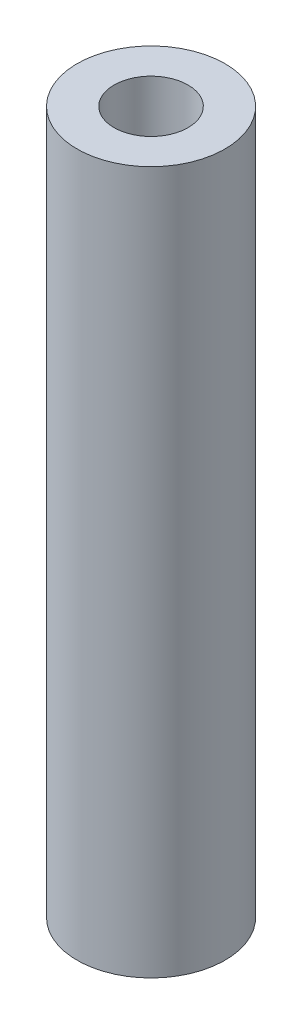
ISO-10303-21;
HEADER;
FILE_DESCRIPTION(('STEP AP214'),'2;1');
FILE_NAME('part.step','',(''),(''),'','','');
FILE_SCHEMA(('AUTOMOTIVE_DESIGN { 1 0 10303 214 1 1 1 1 }'));
ENDSEC;
DATA;
#1=APPLICATION_CONTEXT('core data for automotive mechanical design processes');
#2=APPLICATION_PROTOCOL_DEFINITION('international standard','automotive_design',2000,#1);
#3=PRODUCT_CONTEXT('',#1,'mechanical');
#4=PRODUCT('Part','Part','',(#3));
#5=PRODUCT_RELATED_PRODUCT_CATEGORY('part','',(#4));
#6=PRODUCT_DEFINITION_FORMATION('','',#4);
#7=PRODUCT_DEFINITION_CONTEXT('part definition',#1,'design');
#8=PRODUCT_DEFINITION('design','',#6,#7);
#9=PRODUCT_DEFINITION_SHAPE('','',#8);
#10=(LENGTH_UNIT() NAMED_UNIT(*) SI_UNIT(.MILLI.,.METRE.));
#11=(NAMED_UNIT(*) PLANE_ANGLE_UNIT() SI_UNIT($,.RADIAN.));
#12=(NAMED_UNIT(*) SI_UNIT($,.STERADIAN.) SOLID_ANGLE_UNIT());
#13=UNCERTAINTY_MEASURE_WITH_UNIT(LENGTH_MEASURE(1.E-05),#10,'distance_accuracy_value','');
#14=(GEOMETRIC_REPRESENTATION_CONTEXT(3) GLOBAL_UNCERTAINTY_ASSIGNED_CONTEXT((#13)) GLOBAL_UNIT_ASSIGNED_CONTEXT((#10,
#11,#12)) REPRESENTATION_CONTEXT('',''));
#15=CARTESIAN_POINT('',(0.,0.,0.));
#16=DIRECTION('',(0.,0.,1.));
#17=DIRECTION('',(1.,0.,0.));
#18=AXIS2_PLACEMENT_3D('',#15,#16,#17);
#19=CARTESIAN_POINT('',(0.,48.26,0.));
#20=DIRECTION('',(0.,1.,0.));
#21=DIRECTION('',(0.,0.,1.));
#22=AXIS2_PLACEMENT_3D('',#19,#20,#21);
#23=PLANE('',#22);
#24=CARTESIAN_POINT('',(0.,48.26,0.));
#25=DIRECTION('',(0.,1.,0.));
#26=DIRECTION('',(0.,0.,1.));
#27=AXIS2_PLACEMENT_3D('',#24,#25,#26);
#28=CIRCLE('',#27,5.08);
#29=CARTESIAN_POINT('',(0.,48.26,-5.08));
#30=VERTEX_POINT('',#29);
#31=EDGE_CURVE('E10',#30,#30,#28,.T.);
#32=ORIENTED_EDGE('',*,*,#31,.T.);
#33=EDGE_LOOP('',(#32));
#34=FACE_BOUND('',#33,.T.);
#35=CARTESIAN_POINT('',(0.,48.26,0.));
#36=DIRECTION('',(0.,1.,0.));
#37=DIRECTION('',(0.,0.,1.));
#38=AXIS2_PLACEMENT_3D('',#35,#36,#37);
#39=CIRCLE('',#38,2.54);
#40=CARTESIAN_POINT('',(0.,48.26,-2.54));
#41=VERTEX_POINT('',#40);
#42=EDGE_CURVE('E46',#41,#41,#39,.T.);
#43=ORIENTED_EDGE('',*,*,#42,.F.);
#44=EDGE_LOOP('',(#43));
#45=FACE_BOUND('',#44,.T.);
#46=ADVANCED_FACE('F35',(#34,#45),#23,.T.);
#47=CARTESIAN_POINT('',(0.,0.,0.));
#48=DIRECTION('',(0.,1.,0.));
#49=DIRECTION('',(0.,0.,1.));
#50=AXIS2_PLACEMENT_3D('',#47,#48,#49);
#51=PLANE('',#50);
#52=CARTESIAN_POINT('',(0.,0.,0.));
#53=DIRECTION('',(0.,1.,0.));
#54=DIRECTION('',(0.,0.,1.));
#55=AXIS2_PLACEMENT_3D('',#52,#53,#54);
#56=CIRCLE('',#55,5.08);
#57=CARTESIAN_POINT('',(0.,0.,-5.08));
#58=VERTEX_POINT('',#57);
#59=EDGE_CURVE('E39',#58,#58,#56,.T.);
#60=ORIENTED_EDGE('',*,*,#59,.F.);
#61=EDGE_LOOP('',(#60));
#62=FACE_BOUND('',#61,.T.);
#63=CARTESIAN_POINT('',(0.,0.,0.));
#64=DIRECTION('',(0.,1.,0.));
#65=DIRECTION('',(0.,0.,1.));
#66=AXIS2_PLACEMENT_3D('',#63,#64,#65);
#67=CIRCLE('',#66,2.54);
#68=CARTESIAN_POINT('',(0.,0.,-2.54));
#69=VERTEX_POINT('',#68);
#70=EDGE_CURVE('E48',#69,#69,#67,.T.);
#71=ORIENTED_EDGE('',*,*,#70,.T.);
#72=EDGE_LOOP('',(#71));
#73=FACE_BOUND('',#72,.T.);
#74=ADVANCED_FACE('F58',(#62,#73),#51,.F.);
#75=CARTESIAN_POINT('',(0.,48.26,0.));
#76=DIRECTION('',(0.,-1.,0.));
#77=DIRECTION('',(0.,0.,-1.));
#78=AXIS2_PLACEMENT_3D('',#75,#76,#77);
#79=CYLINDRICAL_SURFACE('',#78,5.08);
#80=CARTESIAN_POINT('',(0.,48.26,-5.08));
#81=CARTESIAN_POINT('',(0.,47.7572916666667,-5.08));
#82=CARTESIAN_POINT('',(0.,47.2545833333333,-5.08));
#83=CARTESIAN_POINT('',(0.,46.2491666666667,-5.08));
#84=CARTESIAN_POINT('',(0.,45.7464583333333,-5.08));
#85=CARTESIAN_POINT('',(0.,44.7410416666667,-5.08));
#86=CARTESIAN_POINT('',(0.,44.2383333333333,-5.08));
#87=CARTESIAN_POINT('',(0.,43.2329166666667,-5.08));
#88=CARTESIAN_POINT('',(0.,42.7302083333333,-5.08));
#89=CARTESIAN_POINT('',(0.,41.7247916666667,-5.08));
#90=CARTESIAN_POINT('',(0.,41.2220833333333,-5.08));
#91=CARTESIAN_POINT('',(0.,40.2166666666667,-5.08));
#92=CARTESIAN_POINT('',(0.,39.7139583333333,-5.08));
#93=CARTESIAN_POINT('',(0.,38.7085416666667,-5.08));
#94=CARTESIAN_POINT('',(0.,38.2058333333333,-5.08));
#95=CARTESIAN_POINT('',(0.,37.2004166666667,-5.08));
#96=CARTESIAN_POINT('',(0.,36.6977083333333,-5.08));
#97=CARTESIAN_POINT('',(0.,35.6922916666667,-5.08));
#98=CARTESIAN_POINT('',(0.,35.1895833333333,-5.08));
#99=CARTESIAN_POINT('',(0.,34.1841666666667,-5.08));
#100=CARTESIAN_POINT('',(0.,33.6814583333333,-5.08));
#101=CARTESIAN_POINT('',(0.,32.6760416666667,-5.08));
#102=CARTESIAN_POINT('',(0.,32.1733333333333,-5.08));
#103=CARTESIAN_POINT('',(0.,31.1679166666667,-5.08));
#104=CARTESIAN_POINT('',(0.,30.6652083333333,-5.08));
#105=CARTESIAN_POINT('',(0.,29.6597916666667,-5.08));
#106=CARTESIAN_POINT('',(0.,29.1570833333333,-5.08));
#107=CARTESIAN_POINT('',(0.,28.1516666666667,-5.08));
#108=CARTESIAN_POINT('',(0.,27.6489583333333,-5.08));
#109=CARTESIAN_POINT('',(0.,26.6435416666667,-5.08));
#110=CARTESIAN_POINT('',(0.,26.1408333333333,-5.08));
#111=CARTESIAN_POINT('',(0.,25.1354166666667,-5.08));
#112=CARTESIAN_POINT('',(0.,24.6327083333333,-5.08));
#113=CARTESIAN_POINT('',(0.,23.6272916666667,-5.08));
#114=CARTESIAN_POINT('',(0.,23.1245833333333,-5.08));
#115=CARTESIAN_POINT('',(0.,22.1191666666667,-5.08));
#116=CARTESIAN_POINT('',(0.,21.6164583333333,-5.08));
#117=CARTESIAN_POINT('',(0.,20.6110416666667,-5.08));
#118=CARTESIAN_POINT('',(0.,20.1083333333333,-5.08));
#119=CARTESIAN_POINT('',(0.,19.1029166666667,-5.08));
#120=CARTESIAN_POINT('',(0.,18.6002083333333,-5.08));
#121=CARTESIAN_POINT('',(0.,17.5947916666667,-5.08));
#122=CARTESIAN_POINT('',(0.,17.0920833333333,-5.08));
#123=CARTESIAN_POINT('',(0.,16.0866666666667,-5.08));
#124=CARTESIAN_POINT('',(0.,15.5839583333333,-5.08));
#125=CARTESIAN_POINT('',(0.,14.5785416666667,-5.08));
#126=CARTESIAN_POINT('',(0.,14.0758333333333,-5.08));
#127=CARTESIAN_POINT('',(0.,13.0704166666667,-5.08));
#128=CARTESIAN_POINT('',(0.,12.5677083333333,-5.08));
#129=CARTESIAN_POINT('',(0.,11.5622916666667,-5.08));
#130=CARTESIAN_POINT('',(0.,11.0595833333333,-5.08));
#131=CARTESIAN_POINT('',(0.,10.0541666666667,-5.08));
#132=CARTESIAN_POINT('',(0.,9.55145833333333,-5.08));
#133=CARTESIAN_POINT('',(0.,8.54604166666666,-5.08));
#134=CARTESIAN_POINT('',(0.,8.04333333333333,-5.08));
#135=CARTESIAN_POINT('',(0.,7.03791666666666,-5.08));
#136=CARTESIAN_POINT('',(0.,6.53520833333333,-5.08));
#137=CARTESIAN_POINT('',(0.,5.52979166666666,-5.08));
#138=CARTESIAN_POINT('',(0.,5.02708333333333,-5.08));
#139=CARTESIAN_POINT('',(0.,4.02166666666666,-5.08));
#140=CARTESIAN_POINT('',(0.,3.51895833333333,-5.08));
#141=CARTESIAN_POINT('',(0.,2.51354166666666,-5.08));
#142=CARTESIAN_POINT('',(0.,2.01083333333333,-5.08));
#143=CARTESIAN_POINT('',(0.,1.00541666666666,-5.08));
#144=CARTESIAN_POINT('',(0.,0.502708333333326,-5.08));
#145=CARTESIAN_POINT('',(0.,0.,-5.08));
#146=B_SPLINE_CURVE_WITH_KNOTS('',3,(#80,#81,#82,#83,#84,#85,#86,#87,#88,#89,#90,#91,#92,#93,
#94,#95,#96,#97,#98,#99,#100,#101,#102,#103,#104,#105,#106,#107,#108,#109,#110,#111,#112,#113,
#114,#115,#116,#117,#118,#119,#120,#121,#122,#123,#124,#125,#126,#127,#128,#129,#130,#131,#132,
#133,#134,#135,#136,#137,#138,#139,#140,#141,#142,#143,#144,#145),.UNSPECIFIED.,.F.,.F.,(4,2,2,
2,2,2,2,2,2,2,2,2,2,2,2,2,2,2,2,2,2,2,2,2,2,2,2,2,2,2,2,2,4),(0.,1.50812500000001,
3.01625000000001,4.524375,6.0325,7.540625,9.04875,10.556875,12.065,13.573125,15.08125,16.589375,
18.0975,19.605625,21.11375,22.621875,24.13,25.638125,27.14625,28.654375,30.1625,31.670625,
33.17875,34.686875,36.195,37.703125,39.21125,40.719375,42.2275,43.735625,45.24375,46.751875,
48.26),.UNSPECIFIED.);
#147=EDGE_CURVE('BSEAM37',#30,#58,#146,.T.);
#148=ORIENTED_EDGE('',*,*,#31,.F.);
#149=ORIENTED_EDGE('',*,*,#59,.T.);
#150=ORIENTED_EDGE('',*,*,#147,.T.);
#151=ORIENTED_EDGE('',*,*,#147,.F.);
#152=EDGE_LOOP('',(#148,#150,#149,#151));
#153=FACE_BOUND('',#152,.T.);
#154=ADVANCED_FACE('F37',(#153),#79,.T.);
#155=CARTESIAN_POINT('',(0.,48.26,0.));
#156=DIRECTION('',(0.,-1.,0.));
#157=DIRECTION('',(0.,0.,-1.));
#158=AXIS2_PLACEMENT_3D('',#155,#156,#157);
#159=CYLINDRICAL_SURFACE('',#158,2.54);
#160=CARTESIAN_POINT('',(0.,48.26,-2.54));
#161=CARTESIAN_POINT('',(0.,47.7572916666667,-2.54));
#162=CARTESIAN_POINT('',(0.,47.2545833333333,-2.54));
#163=CARTESIAN_POINT('',(0.,46.2491666666667,-2.54));
#164=CARTESIAN_POINT('',(0.,45.7464583333333,-2.54));
#165=CARTESIAN_POINT('',(0.,44.7410416666667,-2.54));
#166=CARTESIAN_POINT('',(0.,44.2383333333333,-2.54));
#167=CARTESIAN_POINT('',(0.,43.2329166666667,-2.54));
#168=CARTESIAN_POINT('',(0.,42.7302083333333,-2.54));
#169=CARTESIAN_POINT('',(0.,41.7247916666667,-2.54));
#170=CARTESIAN_POINT('',(0.,41.2220833333333,-2.54));
#171=CARTESIAN_POINT('',(0.,40.2166666666667,-2.54));
#172=CARTESIAN_POINT('',(0.,39.7139583333333,-2.54));
#173=CARTESIAN_POINT('',(0.,38.7085416666667,-2.54));
#174=CARTESIAN_POINT('',(0.,38.2058333333333,-2.54));
#175=CARTESIAN_POINT('',(0.,37.2004166666667,-2.54));
#176=CARTESIAN_POINT('',(0.,36.6977083333333,-2.54));
#177=CARTESIAN_POINT('',(0.,35.6922916666667,-2.54));
#178=CARTESIAN_POINT('',(0.,35.1895833333333,-2.54));
#179=CARTESIAN_POINT('',(0.,34.1841666666667,-2.54));
#180=CARTESIAN_POINT('',(0.,33.6814583333333,-2.54));
#181=CARTESIAN_POINT('',(0.,32.6760416666667,-2.54));
#182=CARTESIAN_POINT('',(0.,32.1733333333333,-2.54));
#183=CARTESIAN_POINT('',(0.,31.1679166666667,-2.54));
#184=CARTESIAN_POINT('',(0.,30.6652083333333,-2.54));
#185=CARTESIAN_POINT('',(0.,29.6597916666667,-2.54));
#186=CARTESIAN_POINT('',(0.,29.1570833333333,-2.54));
#187=CARTESIAN_POINT('',(0.,28.1516666666667,-2.54));
#188=CARTESIAN_POINT('',(0.,27.6489583333333,-2.54));
#189=CARTESIAN_POINT('',(0.,26.6435416666667,-2.54));
#190=CARTESIAN_POINT('',(0.,26.1408333333333,-2.54));
#191=CARTESIAN_POINT('',(0.,25.1354166666667,-2.54));
#192=CARTESIAN_POINT('',(0.,24.6327083333333,-2.54));
#193=CARTESIAN_POINT('',(0.,23.6272916666667,-2.54));
#194=CARTESIAN_POINT('',(0.,23.1245833333333,-2.54));
#195=CARTESIAN_POINT('',(0.,22.1191666666667,-2.54));
#196=CARTESIAN_POINT('',(0.,21.6164583333333,-2.54));
#197=CARTESIAN_POINT('',(0.,20.6110416666667,-2.54));
#198=CARTESIAN_POINT('',(0.,20.1083333333333,-2.54));
#199=CARTESIAN_POINT('',(0.,19.1029166666667,-2.54));
#200=CARTESIAN_POINT('',(0.,18.6002083333333,-2.54));
#201=CARTESIAN_POINT('',(0.,17.5947916666667,-2.54));
#202=CARTESIAN_POINT('',(0.,17.0920833333333,-2.54));
#203=CARTESIAN_POINT('',(0.,16.0866666666667,-2.54));
#204=CARTESIAN_POINT('',(0.,15.5839583333333,-2.54));
#205=CARTESIAN_POINT('',(0.,14.5785416666667,-2.54));
#206=CARTESIAN_POINT('',(0.,14.0758333333333,-2.54));
#207=CARTESIAN_POINT('',(0.,13.0704166666667,-2.54));
#208=CARTESIAN_POINT('',(0.,12.5677083333333,-2.54));
#209=CARTESIAN_POINT('',(0.,11.5622916666667,-2.54));
#210=CARTESIAN_POINT('',(0.,11.0595833333333,-2.54));
#211=CARTESIAN_POINT('',(0.,10.0541666666667,-2.54));
#212=CARTESIAN_POINT('',(0.,9.55145833333333,-2.54));
#213=CARTESIAN_POINT('',(0.,8.54604166666666,-2.54));
#214=CARTESIAN_POINT('',(0.,8.04333333333333,-2.54));
#215=CARTESIAN_POINT('',(0.,7.03791666666666,-2.54));
#216=CARTESIAN_POINT('',(0.,6.53520833333333,-2.54));
#217=CARTESIAN_POINT('',(0.,5.52979166666666,-2.54));
#218=CARTESIAN_POINT('',(0.,5.02708333333333,-2.54));
#219=CARTESIAN_POINT('',(0.,4.02166666666666,-2.54));
#220=CARTESIAN_POINT('',(0.,3.51895833333332,-2.54));
#221=CARTESIAN_POINT('',(0.,2.51354166666666,-2.54));
#222=CARTESIAN_POINT('',(0.,2.01083333333333,-2.54));
#223=CARTESIAN_POINT('',(0.,1.00541666666666,-2.54));
#224=CARTESIAN_POINT('',(0.,0.502708333333326,-2.54));
#225=CARTESIAN_POINT('',(0.,0.,-2.54));
#226=B_SPLINE_CURVE_WITH_KNOTS('',3,(#160,#161,#162,#163,#164,#165,#166,#167,#168,#169,#170,
#171,#172,#173,#174,#175,#176,#177,#178,#179,#180,#181,#182,#183,#184,#185,#186,#187,#188,#189,
#190,#191,#192,#193,#194,#195,#196,#197,#198,#199,#200,#201,#202,#203,#204,#205,#206,#207,#208,
#209,#210,#211,#212,#213,#214,#215,#216,#217,#218,#219,#220,#221,#222,#223,#224,#225),
.UNSPECIFIED.,.F.,.F.,(4,2,2,2,2,2,2,2,2,2,2,2,2,2,2,2,2,2,2,2,2,2,2,2,2,2,2,2,2,2,2,2,4),(0.,
1.508125,3.01625,4.524375,6.0325,7.540625,9.04874999999999,10.556875,12.065,13.573125,15.08125,
16.589375,18.0975,19.605625,21.11375,22.621875,24.13,25.638125,27.14625,28.654375,30.1625,
31.670625,33.17875,34.686875,36.195,37.703125,39.21125,40.719375,42.2275,43.735625,45.24375,
46.751875,48.26),.UNSPECIFIED.);
#227=EDGE_CURVE('BSEAM54',#41,#69,#226,.T.);
#228=ORIENTED_EDGE('',*,*,#42,.T.);
#229=ORIENTED_EDGE('',*,*,#70,.F.);
#230=ORIENTED_EDGE('',*,*,#227,.T.);
#231=ORIENTED_EDGE('',*,*,#227,.F.);
#232=EDGE_LOOP('',(#228,#230,#229,#231));
#233=FACE_BOUND('',#232,.T.);
#234=ADVANCED_FACE('F54',(#233),#159,.F.);
#235=CLOSED_SHELL('',(#46,#74,#154,#234));
#236=MANIFOLD_SOLID_BREP('B2',#235);
#237=ADVANCED_BREP_SHAPE_REPRESENTATION('',(#18,#236),#14);
#238=SHAPE_DEFINITION_REPRESENTATION(#9,#237);
ENDSEC;
END-ISO-10303-21;
